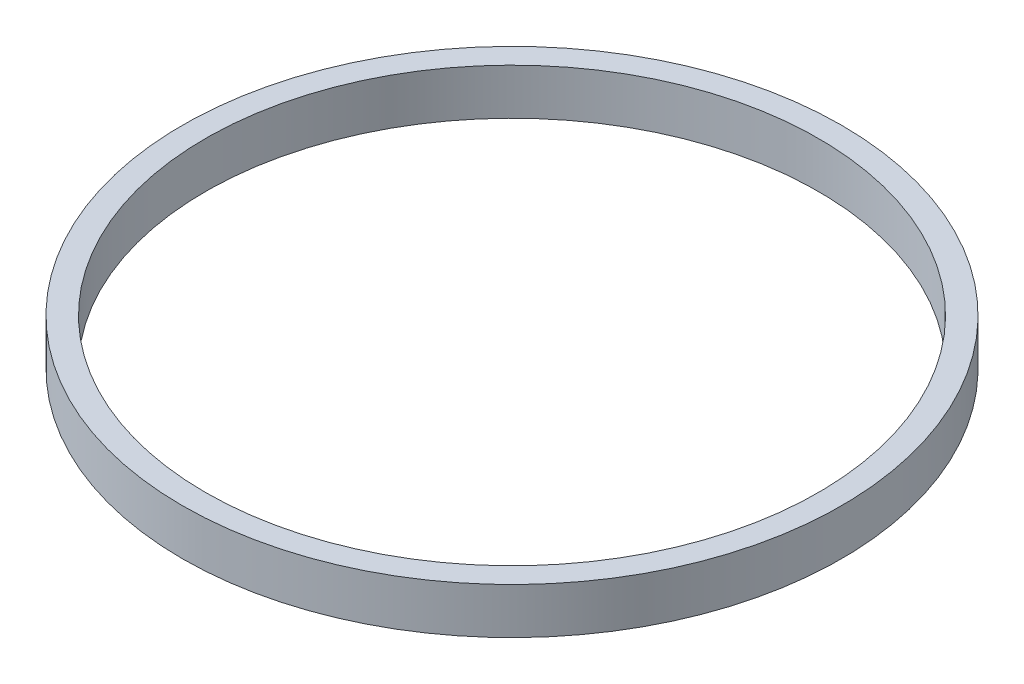
ISO-10303-21;
HEADER;
FILE_DESCRIPTION(('STEP AP214'),'2;1');
FILE_NAME('part.step','',(''),(''),'','','');
FILE_SCHEMA(('AUTOMOTIVE_DESIGN { 1 0 10303 214 1 1 1 1 }'));
ENDSEC;
DATA;
#1=APPLICATION_CONTEXT('core data for automotive mechanical design processes');
#2=APPLICATION_PROTOCOL_DEFINITION('international standard','automotive_design',2000,#1);
#3=PRODUCT_CONTEXT('',#1,'mechanical');
#4=PRODUCT('Part','Part','',(#3));
#5=PRODUCT_RELATED_PRODUCT_CATEGORY('part','',(#4));
#6=PRODUCT_DEFINITION_FORMATION('','',#4);
#7=PRODUCT_DEFINITION_CONTEXT('part definition',#1,'design');
#8=PRODUCT_DEFINITION('design','',#6,#7);
#9=PRODUCT_DEFINITION_SHAPE('','',#8);
#10=(LENGTH_UNIT() NAMED_UNIT(*) SI_UNIT(.MILLI.,.METRE.));
#11=(NAMED_UNIT(*) PLANE_ANGLE_UNIT() SI_UNIT($,.RADIAN.));
#12=(NAMED_UNIT(*) SI_UNIT($,.STERADIAN.) SOLID_ANGLE_UNIT());
#13=UNCERTAINTY_MEASURE_WITH_UNIT(LENGTH_MEASURE(1.E-05),#10,'distance_accuracy_value','');
#14=(GEOMETRIC_REPRESENTATION_CONTEXT(3) GLOBAL_UNCERTAINTY_ASSIGNED_CONTEXT((#13)) GLOBAL_UNIT_ASSIGNED_CONTEXT((#10,
#11,#12)) REPRESENTATION_CONTEXT('',''));
#15=CARTESIAN_POINT('',(0.,0.,0.));
#16=DIRECTION('',(0.,0.,1.));
#17=DIRECTION('',(1.,0.,0.));
#18=AXIS2_PLACEMENT_3D('',#15,#16,#17);
#19=CARTESIAN_POINT('',(0.,3.,0.));
#20=DIRECTION('',(0.,1.,0.));
#21=DIRECTION('',(0.,0.,1.));
#22=AXIS2_PLACEMENT_3D('',#19,#20,#21);
#23=PLANE('',#22);
#24=CARTESIAN_POINT('',(0.,3.,0.));
#25=DIRECTION('',(0.,1.,0.));
#26=DIRECTION('',(0.,0.,1.));
#27=AXIS2_PLACEMENT_3D('',#24,#25,#26);
#28=CIRCLE('',#27,21.5);
#29=CARTESIAN_POINT('',(0.,3.,21.5));
#30=VERTEX_POINT('',#29);
#31=EDGE_CURVE('E10',#30,#30,#28,.T.);
#32=ORIENTED_EDGE('',*,*,#31,.T.);
#33=EDGE_LOOP('',(#32));
#34=FACE_BOUND('',#33,.T.);
#35=CARTESIAN_POINT('',(0.,3.,0.));
#36=DIRECTION('',(0.,1.,0.));
#37=DIRECTION('',(0.,0.,1.));
#38=AXIS2_PLACEMENT_3D('',#35,#36,#37);
#39=CIRCLE('',#38,20.);
#40=CARTESIAN_POINT('',(0.,3.,20.));
#41=VERTEX_POINT('',#40);
#42=EDGE_CURVE('E43',#41,#41,#39,.T.);
#43=ORIENTED_EDGE('',*,*,#42,.F.);
#44=EDGE_LOOP('',(#43));
#45=FACE_BOUND('',#44,.T.);
#46=ADVANCED_FACE('F32',(#34,#45),#23,.T.);
#47=CARTESIAN_POINT('',(0.,0.,0.));
#48=DIRECTION('',(0.,1.,0.));
#49=DIRECTION('',(0.,0.,1.));
#50=AXIS2_PLACEMENT_3D('',#47,#48,#49);
#51=PLANE('',#50);
#52=CARTESIAN_POINT('',(0.,0.,0.));
#53=DIRECTION('',(0.,1.,0.));
#54=DIRECTION('',(0.,0.,1.));
#55=AXIS2_PLACEMENT_3D('',#52,#53,#54);
#56=CIRCLE('',#55,21.5);
#57=CARTESIAN_POINT('',(0.,0.,21.5));
#58=VERTEX_POINT('',#57);
#59=EDGE_CURVE('E36',#58,#58,#56,.T.);
#60=ORIENTED_EDGE('',*,*,#59,.F.);
#61=EDGE_LOOP('',(#60));
#62=FACE_BOUND('',#61,.T.);
#63=CARTESIAN_POINT('',(0.,0.,0.));
#64=DIRECTION('',(0.,1.,0.));
#65=DIRECTION('',(0.,0.,1.));
#66=AXIS2_PLACEMENT_3D('',#63,#64,#65);
#67=CIRCLE('',#66,20.);
#68=CARTESIAN_POINT('',(0.,0.,20.));
#69=VERTEX_POINT('',#68);
#70=EDGE_CURVE('E45',#69,#69,#67,.T.);
#71=ORIENTED_EDGE('',*,*,#70,.T.);
#72=EDGE_LOOP('',(#71));
#73=FACE_BOUND('',#72,.T.);
#74=ADVANCED_FACE('F55',(#62,#73),#51,.F.);
#75=CARTESIAN_POINT('',(0.,3.,0.));
#76=DIRECTION('',(0.,-1.,0.));
#77=DIRECTION('',(0.,0.,-1.));
#78=AXIS2_PLACEMENT_3D('',#75,#76,#77);
#79=CYLINDRICAL_SURFACE('',#78,21.5);
#80=ORIENTED_EDGE('',*,*,#31,.F.);
#81=EDGE_LOOP('',(#80));
#82=FACE_BOUND('',#81,.T.);
#83=ORIENTED_EDGE('',*,*,#59,.T.);
#84=EDGE_LOOP('',(#83));
#85=FACE_BOUND('',#84,.T.);
#86=ADVANCED_FACE('F34',(#82,#85),#79,.T.);
#87=CARTESIAN_POINT('',(0.,3.,0.));
#88=DIRECTION('',(0.,-1.,0.));
#89=DIRECTION('',(0.,0.,-1.));
#90=AXIS2_PLACEMENT_3D('',#87,#88,#89);
#91=CYLINDRICAL_SURFACE('',#90,20.);
#92=ORIENTED_EDGE('',*,*,#42,.T.);
#93=EDGE_LOOP('',(#92));
#94=FACE_BOUND('',#93,.T.);
#95=ORIENTED_EDGE('',*,*,#70,.F.);
#96=EDGE_LOOP('',(#95));
#97=FACE_BOUND('',#96,.T.);
#98=ADVANCED_FACE('F51',(#94,#97),#91,.F.);
#99=CLOSED_SHELL('',(#46,#74,#86,#98));
#100=MANIFOLD_SOLID_BREP('B2',#99);
#101=ADVANCED_BREP_SHAPE_REPRESENTATION('',(#18,#100),#14);
#102=SHAPE_DEFINITION_REPRESENTATION(#9,#101);
ENDSEC;
END-ISO-10303-21;
